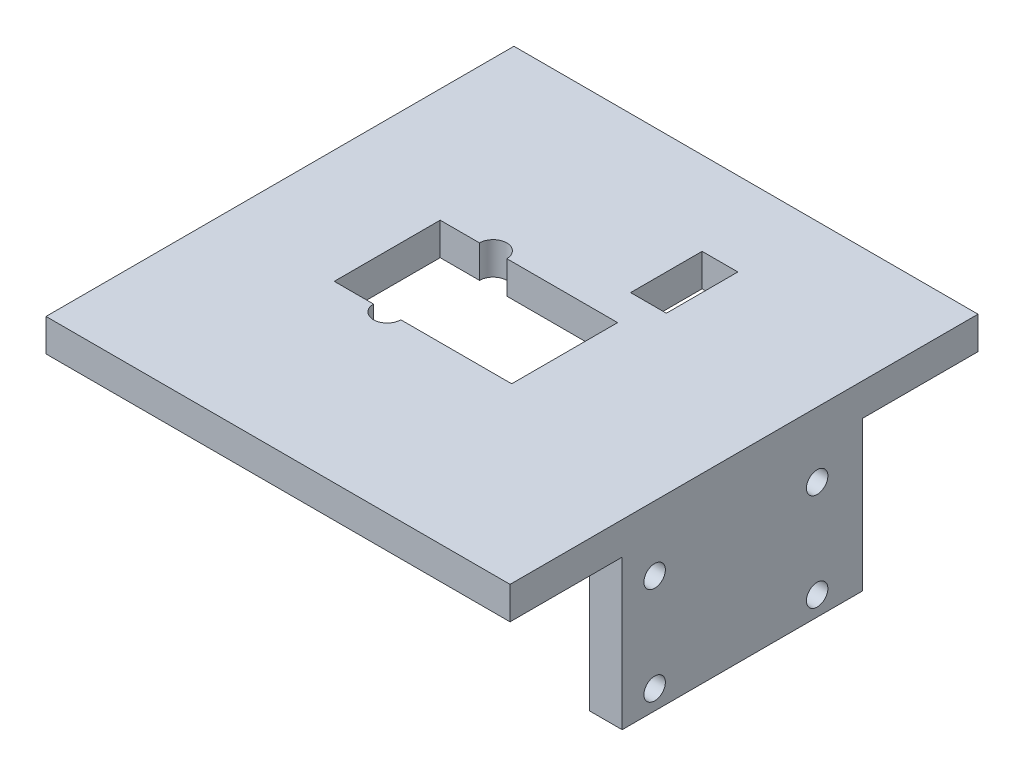
ISO-10303-21;
HEADER;
FILE_DESCRIPTION(('STEP AP214'),'2;1');
FILE_NAME('part.step','',(''),(''),'','','');
FILE_SCHEMA(('AUTOMOTIVE_DESIGN { 1 0 10303 214 1 1 1 1 }'));
ENDSEC;
DATA;
#1=APPLICATION_CONTEXT('core data for automotive mechanical design processes');
#2=APPLICATION_PROTOCOL_DEFINITION('international standard','automotive_design',2000,#1);
#3=PRODUCT_CONTEXT('',#1,'mechanical');
#4=PRODUCT('Part','Part','',(#3));
#5=PRODUCT_RELATED_PRODUCT_CATEGORY('part','',(#4));
#6=PRODUCT_DEFINITION_FORMATION('','',#4);
#7=PRODUCT_DEFINITION_CONTEXT('part definition',#1,'design');
#8=PRODUCT_DEFINITION('design','',#6,#7);
#9=PRODUCT_DEFINITION_SHAPE('','',#8);
#10=(LENGTH_UNIT() NAMED_UNIT(*) SI_UNIT(.MILLI.,.METRE.));
#11=(NAMED_UNIT(*) PLANE_ANGLE_UNIT() SI_UNIT($,.RADIAN.));
#12=(NAMED_UNIT(*) SI_UNIT($,.STERADIAN.) SOLID_ANGLE_UNIT());
#13=UNCERTAINTY_MEASURE_WITH_UNIT(LENGTH_MEASURE(1.E-05),#10,'distance_accuracy_value','');
#14=(GEOMETRIC_REPRESENTATION_CONTEXT(3) GLOBAL_UNCERTAINTY_ASSIGNED_CONTEXT((#13)) GLOBAL_UNIT_ASSIGNED_CONTEXT((#10,
#11,#12)) REPRESENTATION_CONTEXT('',''));
#15=CARTESIAN_POINT('',(0.,0.,0.));
#16=DIRECTION('',(0.,0.,1.));
#17=DIRECTION('',(1.,0.,0.));
#18=AXIS2_PLACEMENT_3D('',#15,#16,#17);
#19=CARTESIAN_POINT('',(55.,5.,0.));
#20=DIRECTION('',(-1.,0.,0.));
#21=DIRECTION('',(0.,0.,1.));
#22=AXIS2_PLACEMENT_3D('',#19,#20,#21);
#23=PLANE('',#22);
#24=CARTESIAN_POINT('',(55.,-20.,7.));
#25=DIRECTION('',(1.,0.,0.));
#26=DIRECTION('',(0.,0.,-1.));
#27=AXIS2_PLACEMENT_3D('',#24,#25,#26);
#28=CIRCLE('',#27,1.65);
#29=CARTESIAN_POINT('',(55.,-20.,5.35));
#30=VERTEX_POINT('',#29);
#31=EDGE_CURVE('E318',#30,#30,#28,.T.);
#32=ORIENTED_EDGE('',*,*,#31,.F.);
#33=EDGE_LOOP('',(#32));
#34=FACE_BOUND('',#33,.T.);
#35=CARTESIAN_POINT('',(55.,-20.,32.));
#36=DIRECTION('',(1.,0.,0.));
#37=DIRECTION('',(0.,0.,-1.));
#38=AXIS2_PLACEMENT_3D('',#35,#36,#37);
#39=CIRCLE('',#38,1.65);
#40=CARTESIAN_POINT('',(55.,-20.,30.35));
#41=VERTEX_POINT('',#40);
#42=EDGE_CURVE('E312',#41,#41,#39,.T.);
#43=ORIENTED_EDGE('',*,*,#42,.F.);
#44=EDGE_LOOP('',(#43));
#45=FACE_BOUND('',#44,.T.);
#46=CARTESIAN_POINT('',(55.,-5.,32.));
#47=DIRECTION('',(1.,0.,0.));
#48=DIRECTION('',(0.,0.,-1.));
#49=AXIS2_PLACEMENT_3D('',#46,#47,#48);
#50=CIRCLE('',#49,1.65);
#51=CARTESIAN_POINT('',(55.,-5.,30.35));
#52=VERTEX_POINT('',#51);
#53=EDGE_CURVE('E305',#52,#52,#50,.T.);
#54=ORIENTED_EDGE('',*,*,#53,.F.);
#55=EDGE_LOOP('',(#54));
#56=FACE_BOUND('',#55,.T.);
#57=CARTESIAN_POINT('',(55.,-5.,7.));
#58=DIRECTION('',(1.,0.,0.));
#59=DIRECTION('',(0.,0.,-1.));
#60=AXIS2_PLACEMENT_3D('',#57,#58,#59);
#61=CIRCLE('',#60,1.65);
#62=CARTESIAN_POINT('',(55.,-5.,5.35));
#63=VERTEX_POINT('',#62);
#64=EDGE_CURVE('E308',#63,#63,#61,.T.);
#65=ORIENTED_EDGE('',*,*,#64,.F.);
#66=EDGE_LOOP('',(#65));
#67=FACE_BOUND('',#66,.T.);
#68=DIRECTION('',(0.,0.,-1.));
#69=VECTOR('',#68,1.);
#70=CARTESIAN_POINT('',(55.,5.,0.));
#71=LINE('',#70,#69);
#72=CARTESIAN_POINT('',(55.,5.,54.25));
#73=VERTEX_POINT('',#72);
#74=CARTESIAN_POINT('',(55.,5.,-17.75));
#75=VERTEX_POINT('',#74);
#76=EDGE_CURVE('E347',#73,#75,#71,.T.);
#77=ORIENTED_EDGE('',*,*,#76,.F.);
#78=DIRECTION('',(0.,1.,0.));
#79=VECTOR('',#78,1.);
#80=CARTESIAN_POINT('',(55.,0.,54.25));
#81=LINE('',#80,#79);
#82=CARTESIAN_POINT('',(55.,0.,54.25));
#83=VERTEX_POINT('',#82);
#84=EDGE_CURVE('E189',#83,#73,#81,.T.);
#85=ORIENTED_EDGE('',*,*,#84,.F.);
#86=DIRECTION('',(0.,0.,-1.));
#87=VECTOR('',#86,1.);
#88=CARTESIAN_POINT('',(55.,0.,0.));
#89=LINE('',#88,#87);
#90=CARTESIAN_POINT('',(55.,0.,37.));
#91=VERTEX_POINT('',#90);
#92=EDGE_CURVE('E344',#83,#91,#89,.T.);
#93=ORIENTED_EDGE('',*,*,#92,.T.);
#94=DIRECTION('',(0.,-1.,0.));
#95=VECTOR('',#94,1.);
#96=CARTESIAN_POINT('',(55.,5.,37.));
#97=LINE('',#96,#95);
#98=CARTESIAN_POINT('',(55.,-23.,37.));
#99=VERTEX_POINT('',#98);
#100=EDGE_CURVE('E326',#91,#99,#97,.T.);
#101=ORIENTED_EDGE('',*,*,#100,.T.);
#102=DIRECTION('',(0.,0.,-1.));
#103=VECTOR('',#102,1.);
#104=CARTESIAN_POINT('',(55.,-23.,0.));
#105=LINE('',#104,#103);
#106=CARTESIAN_POINT('',(55.,-23.,0.));
#107=VERTEX_POINT('',#106);
#108=EDGE_CURVE('E333',#99,#107,#105,.T.);
#109=ORIENTED_EDGE('',*,*,#108,.T.);
#110=DIRECTION('',(0.,-1.,0.));
#111=VECTOR('',#110,1.);
#112=CARTESIAN_POINT('',(55.,5.,0.));
#113=LINE('',#112,#111);
#114=CARTESIAN_POINT('',(55.,0.,0.));
#115=VERTEX_POINT('',#114);
#116=EDGE_CURVE('E184',#115,#107,#113,.T.);
#117=ORIENTED_EDGE('',*,*,#116,.F.);
#118=DIRECTION('',(0.,0.,-1.));
#119=VECTOR('',#118,1.);
#120=CARTESIAN_POINT('',(55.,0.,0.));
#121=LINE('',#120,#119);
#122=CARTESIAN_POINT('',(55.,0.,-17.75));
#123=VERTEX_POINT('',#122);
#124=EDGE_CURVE('E178',#115,#123,#121,.T.);
#125=ORIENTED_EDGE('',*,*,#124,.T.);
#126=DIRECTION('',(0.,1.,0.));
#127=VECTOR('',#126,1.);
#128=CARTESIAN_POINT('',(55.,0.,-17.75));
#129=LINE('',#128,#127);
#130=EDGE_CURVE('E181',#123,#75,#129,.T.);
#131=ORIENTED_EDGE('',*,*,#130,.T.);
#132=EDGE_LOOP('',(#77,#85,#93,#101,#109,#117,#125,#131));
#133=FACE_BOUND('',#132,.T.);
#134=ADVANCED_FACE('F41',(#34,#45,#56,#67,#133),#23,.F.);
#135=CARTESIAN_POINT('',(0.,5.,0.));
#136=DIRECTION('',(0.,0.,1.));
#137=DIRECTION('',(1.,0.,0.));
#138=AXIS2_PLACEMENT_3D('',#135,#136,#137);
#139=PLANE('',#138);
#140=DIRECTION('',(0.,1.,0.));
#141=VECTOR('',#140,1.);
#142=CARTESIAN_POINT('',(50.,5.,0.));
#143=LINE('',#142,#141);
#144=CARTESIAN_POINT('',(50.,-23.,0.));
#145=VERTEX_POINT('',#144);
#146=CARTESIAN_POINT('',(50.,0.,0.));
#147=VERTEX_POINT('',#146);
#148=EDGE_CURVE('E329',#145,#147,#143,.T.);
#149=ORIENTED_EDGE('',*,*,#148,.T.);
#150=DIRECTION('',(1.,0.,0.));
#151=VECTOR('',#150,1.);
#152=CARTESIAN_POINT('',(0.,0.,0.));
#153=LINE('',#152,#151);
#154=EDGE_CURVE('E301',#147,#115,#153,.T.);
#155=ORIENTED_EDGE('',*,*,#154,.T.);
#156=ORIENTED_EDGE('',*,*,#116,.T.);
#157=DIRECTION('',(1.,0.,0.));
#158=VECTOR('',#157,1.);
#159=CARTESIAN_POINT('',(50.,-23.,0.));
#160=LINE('',#159,#158);
#161=EDGE_CURVE('E341',#145,#107,#160,.T.);
#162=ORIENTED_EDGE('',*,*,#161,.F.);
#163=EDGE_LOOP('',(#149,#155,#156,#162));
#164=FACE_BOUND('',#163,.T.);
#165=ADVANCED_FACE('F391',(#164),#139,.F.);
#166=CARTESIAN_POINT('',(0.,5.,0.));
#167=DIRECTION('',(0.,1.,0.));
#168=DIRECTION('',(0.,0.,1.));
#169=AXIS2_PLACEMENT_3D('',#166,#167,#168);
#170=PLANE('',#169);
#171=DIRECTION('',(0.,0.,1.));
#172=VECTOR('',#171,1.);
#173=CARTESIAN_POINT('',(25.4,5.,-4.9));
#174=LINE('',#173,#172);
#175=CARTESIAN_POINT('',(25.4,5.,-4.9));
#176=VERTEX_POINT('',#175);
#177=CARTESIAN_POINT('',(25.4,5.,6.1));
#178=VERTEX_POINT('',#177);
#179=EDGE_CURVE('E55',#176,#178,#174,.T.);
#180=ORIENTED_EDGE('',*,*,#179,.F.);
#181=DIRECTION('',(-1.,0.,0.));
#182=VECTOR('',#181,1.);
#183=CARTESIAN_POINT('',(25.4,5.,-4.9));
#184=LINE('',#183,#182);
#185=CARTESIAN_POINT('',(30.9,5.,-4.9));
#186=VERTEX_POINT('',#185);
#187=EDGE_CURVE('E222',#186,#176,#184,.T.);
#188=ORIENTED_EDGE('',*,*,#187,.F.);
#189=DIRECTION('',(0.,0.,-1.));
#190=VECTOR('',#189,1.);
#191=CARTESIAN_POINT('',(30.9,5.,-4.9));
#192=LINE('',#191,#190);
#193=CARTESIAN_POINT('',(30.9,5.,6.1));
#194=VERTEX_POINT('',#193);
#195=EDGE_CURVE('E219',#194,#186,#192,.T.);
#196=ORIENTED_EDGE('',*,*,#195,.F.);
#197=DIRECTION('',(1.,0.,0.));
#198=VECTOR('',#197,1.);
#199=CARTESIAN_POINT('',(25.4,5.,6.1));
#200=LINE('',#199,#198);
#201=EDGE_CURVE('E217',#178,#194,#200,.T.);
#202=ORIENTED_EDGE('',*,*,#201,.F.);
#203=EDGE_LOOP('',(#180,#188,#196,#202));
#204=FACE_BOUND('',#203,.T.);
#205=DIRECTION('',(-1.,0.,0.));
#206=VECTOR('',#205,1.);
#207=CARTESIAN_POINT('',(17.4,5.,11.1));
#208=LINE('',#207,#206);
#209=CARTESIAN_POINT('',(28.4,5.,11.1));
#210=VERTEX_POINT('',#209);
#211=CARTESIAN_POINT('',(11.35,5.,11.1));
#212=VERTEX_POINT('',#211);
#213=EDGE_CURVE('E237',#210,#212,#208,.T.);
#214=ORIENTED_EDGE('',*,*,#213,.F.);
#215=DIRECTION('',(0.,0.,-1.));
#216=VECTOR('',#215,1.);
#217=CARTESIAN_POINT('',(28.4,5.,11.1));
#218=LINE('',#217,#216);
#219=CARTESIAN_POINT('',(28.4,5.,27.4));
#220=VERTEX_POINT('',#219);
#221=EDGE_CURVE('E276',#220,#210,#218,.T.);
#222=ORIENTED_EDGE('',*,*,#221,.F.);
#223=DIRECTION('',(1.,0.,0.));
#224=VECTOR('',#223,1.);
#225=CARTESIAN_POINT('',(28.4,5.,27.4));
#226=LINE('',#225,#224);
#227=CARTESIAN_POINT('',(11.35,5.,27.4));
#228=VERTEX_POINT('',#227);
#229=EDGE_CURVE('E273',#228,#220,#226,.T.);
#230=ORIENTED_EDGE('',*,*,#229,.F.);
#231=CARTESIAN_POINT('',(9.25,5.,27.4));
#232=DIRECTION('',(0.,1.,0.));
#233=DIRECTION('',(0.,0.,1.));
#234=AXIS2_PLACEMENT_3D('',#231,#232,#233);
#235=CIRCLE('',#234,2.09999999999999);
#236=CARTESIAN_POINT('',(7.15,5.,27.4));
#237=VERTEX_POINT('',#236);
#238=EDGE_CURVE('E270',#237,#228,#235,.T.);
#239=ORIENTED_EDGE('',*,*,#238,.F.);
#240=DIRECTION('',(1.,0.,0.));
#241=VECTOR('',#240,1.);
#242=CARTESIAN_POINT('',(1.1,5.,27.4));
#243=LINE('',#242,#241);
#244=CARTESIAN_POINT('',(1.1,5.,27.4));
#245=VERTEX_POINT('',#244);
#246=EDGE_CURVE('E267',#245,#237,#243,.T.);
#247=ORIENTED_EDGE('',*,*,#246,.F.);
#248=DIRECTION('',(0.,0.,1.));
#249=VECTOR('',#248,1.);
#250=CARTESIAN_POINT('',(1.1,5.,27.4));
#251=LINE('',#250,#249);
#252=CARTESIAN_POINT('',(1.1,5.,11.1));
#253=VERTEX_POINT('',#252);
#254=EDGE_CURVE('E264',#253,#245,#251,.T.);
#255=ORIENTED_EDGE('',*,*,#254,.F.);
#256=DIRECTION('',(-1.,0.,0.));
#257=VECTOR('',#256,1.);
#258=CARTESIAN_POINT('',(1.1,5.,11.1));
#259=LINE('',#258,#257);
#260=CARTESIAN_POINT('',(7.15,5.,11.1));
#261=VERTEX_POINT('',#260);
#262=EDGE_CURVE('E261',#261,#253,#259,.T.);
#263=ORIENTED_EDGE('',*,*,#262,.F.);
#264=CARTESIAN_POINT('',(9.25000000000001,5.,11.1));
#265=DIRECTION('',(0.,1.,0.));
#266=DIRECTION('',(0.,0.,-1.));
#267=AXIS2_PLACEMENT_3D('',#264,#265,#266);
#268=CIRCLE('',#267,2.1);
#269=EDGE_CURVE('E228',#212,#261,#268,.T.);
#270=ORIENTED_EDGE('',*,*,#269,.F.);
#271=EDGE_LOOP('',(#214,#222,#230,#239,#247,#255,#263,#270));
#272=FACE_BOUND('',#271,.T.);
#273=DIRECTION('',(-1.,0.,0.));
#274=VECTOR('',#273,1.);
#275=CARTESIAN_POINT('',(0.,5.,54.25));
#276=LINE('',#275,#274);
#277=CARTESIAN_POINT('',(-16.4,5.,54.25));
#278=VERTEX_POINT('',#277);
#279=EDGE_CURVE('E283',#73,#278,#276,.T.);
#280=ORIENTED_EDGE('',*,*,#279,.F.);
#281=ORIENTED_EDGE('',*,*,#76,.T.);
#282=DIRECTION('',(-1.,0.,0.));
#283=VECTOR('',#282,1.);
#284=CARTESIAN_POINT('',(-16.4,5.,-17.75));
#285=LINE('',#284,#283);
#286=CARTESIAN_POINT('',(-16.4,5.,-17.75));
#287=VERTEX_POINT('',#286);
#288=EDGE_CURVE('E197',#75,#287,#285,.T.);
#289=ORIENTED_EDGE('',*,*,#288,.T.);
#290=DIRECTION('',(0.,0.,1.));
#291=VECTOR('',#290,1.);
#292=CARTESIAN_POINT('',(-16.4,5.,-15.75));
#293=LINE('',#292,#291);
#294=EDGE_CURVE('E208',#287,#278,#293,.T.);
#295=ORIENTED_EDGE('',*,*,#294,.T.);
#296=EDGE_LOOP('',(#280,#281,#289,#295));
#297=FACE_BOUND('',#296,.T.);
#298=ADVANCED_FACE('F373',(#204,#272,#297),#170,.T.);
#299=CARTESIAN_POINT('',(0.,0.,0.));
#300=DIRECTION('',(0.,1.,0.));
#301=DIRECTION('',(0.,0.,1.));
#302=AXIS2_PLACEMENT_3D('',#299,#300,#301);
#303=PLANE('',#302);
#304=DIRECTION('',(-1.,0.,0.));
#305=VECTOR('',#304,1.);
#306=CARTESIAN_POINT('',(0.,0.,-4.90000000000001));
#307=LINE('',#306,#305);
#308=CARTESIAN_POINT('',(30.9,0.,-4.9));
#309=VERTEX_POINT('',#308);
#310=CARTESIAN_POINT('',(25.4,0.,-4.9));
#311=VERTEX_POINT('',#310);
#312=EDGE_CURVE('E48',#309,#311,#307,.T.);
#313=ORIENTED_EDGE('',*,*,#312,.T.);
#314=DIRECTION('',(0.,0.,1.));
#315=VECTOR('',#314,1.);
#316=CARTESIAN_POINT('',(25.4,0.,0.));
#317=LINE('',#316,#315);
#318=CARTESIAN_POINT('',(25.4,0.,6.1));
#319=VERTEX_POINT('',#318);
#320=EDGE_CURVE('E11',#311,#319,#317,.T.);
#321=ORIENTED_EDGE('',*,*,#320,.T.);
#322=DIRECTION('',(1.,0.,0.));
#323=VECTOR('',#322,1.);
#324=CARTESIAN_POINT('',(0.,0.,6.10000000000001));
#325=LINE('',#324,#323);
#326=CARTESIAN_POINT('',(30.9,0.,6.1));
#327=VERTEX_POINT('',#326);
#328=EDGE_CURVE('E302',#319,#327,#325,.T.);
#329=ORIENTED_EDGE('',*,*,#328,.T.);
#330=DIRECTION('',(0.,0.,-1.));
#331=VECTOR('',#330,1.);
#332=CARTESIAN_POINT('',(30.9,0.,0.));
#333=LINE('',#332,#331);
#334=EDGE_CURVE('E358',#327,#309,#333,.T.);
#335=ORIENTED_EDGE('',*,*,#334,.T.);
#336=EDGE_LOOP('',(#313,#321,#329,#335));
#337=FACE_BOUND('',#336,.T.);
#338=DIRECTION('',(0.,0.,-1.));
#339=VECTOR('',#338,1.);
#340=CARTESIAN_POINT('',(28.4,0.,11.1));
#341=LINE('',#340,#339);
#342=CARTESIAN_POINT('',(28.4,0.,27.4));
#343=VERTEX_POINT('',#342);
#344=CARTESIAN_POINT('',(28.4,0.,11.1));
#345=VERTEX_POINT('',#344);
#346=EDGE_CURVE('E255',#343,#345,#341,.T.);
#347=ORIENTED_EDGE('',*,*,#346,.T.);
#348=DIRECTION('',(-1.,0.,0.));
#349=VECTOR('',#348,1.);
#350=CARTESIAN_POINT('',(11.35,0.,11.1));
#351=LINE('',#350,#349);
#352=CARTESIAN_POINT('',(11.35,0.,11.1));
#353=VERTEX_POINT('',#352);
#354=EDGE_CURVE('E233',#345,#353,#351,.T.);
#355=ORIENTED_EDGE('',*,*,#354,.T.);
#356=CARTESIAN_POINT('',(9.25000000000001,0.,11.1));
#357=DIRECTION('',(0.,1.,0.));
#358=DIRECTION('',(0.,0.,-1.));
#359=AXIS2_PLACEMENT_3D('',#356,#357,#358);
#360=CIRCLE('',#359,2.1);
#361=CARTESIAN_POINT('',(7.15,0.,11.1));
#362=VERTEX_POINT('',#361);
#363=EDGE_CURVE('E236',#353,#362,#360,.T.);
#364=ORIENTED_EDGE('',*,*,#363,.T.);
#365=DIRECTION('',(-1.,0.,0.));
#366=VECTOR('',#365,1.);
#367=CARTESIAN_POINT('',(1.1,0.,11.1));
#368=LINE('',#367,#366);
#369=CARTESIAN_POINT('',(1.1,0.,11.1));
#370=VERTEX_POINT('',#369);
#371=EDGE_CURVE('E240',#362,#370,#368,.T.);
#372=ORIENTED_EDGE('',*,*,#371,.T.);
#373=DIRECTION('',(0.,0.,1.));
#374=VECTOR('',#373,1.);
#375=CARTESIAN_POINT('',(1.1,0.,27.4));
#376=LINE('',#375,#374);
#377=CARTESIAN_POINT('',(1.1,0.,27.4));
#378=VERTEX_POINT('',#377);
#379=EDGE_CURVE('E243',#370,#378,#376,.T.);
#380=ORIENTED_EDGE('',*,*,#379,.T.);
#381=DIRECTION('',(1.,0.,0.));
#382=VECTOR('',#381,1.);
#383=CARTESIAN_POINT('',(1.1,0.,27.4));
#384=LINE('',#383,#382);
#385=CARTESIAN_POINT('',(7.15,0.,27.4));
#386=VERTEX_POINT('',#385);
#387=EDGE_CURVE('E246',#378,#386,#384,.T.);
#388=ORIENTED_EDGE('',*,*,#387,.T.);
#389=CARTESIAN_POINT('',(9.25,0.,27.4));
#390=DIRECTION('',(0.,1.,0.));
#391=DIRECTION('',(0.,0.,1.));
#392=AXIS2_PLACEMENT_3D('',#389,#390,#391);
#393=CIRCLE('',#392,2.09999999999999);
#394=CARTESIAN_POINT('',(11.35,0.,27.4));
#395=VERTEX_POINT('',#394);
#396=EDGE_CURVE('E249',#386,#395,#393,.T.);
#397=ORIENTED_EDGE('',*,*,#396,.T.);
#398=DIRECTION('',(1.,0.,0.));
#399=VECTOR('',#398,1.);
#400=CARTESIAN_POINT('',(11.35,0.,27.4));
#401=LINE('',#400,#399);
#402=EDGE_CURVE('E252',#395,#343,#401,.T.);
#403=ORIENTED_EDGE('',*,*,#402,.T.);
#404=EDGE_LOOP('',(#347,#355,#364,#372,#380,#388,#397,#403));
#405=FACE_BOUND('',#404,.T.);
#406=ORIENTED_EDGE('',*,*,#92,.F.);
#407=DIRECTION('',(-1.,0.,0.));
#408=VECTOR('',#407,1.);
#409=CARTESIAN_POINT('',(0.,0.,54.25));
#410=LINE('',#409,#408);
#411=CARTESIAN_POINT('',(-16.4,0.,54.25));
#412=VERTEX_POINT('',#411);
#413=EDGE_CURVE('E297',#83,#412,#410,.T.);
#414=ORIENTED_EDGE('',*,*,#413,.T.);
#415=DIRECTION('',(0.,0.,1.));
#416=VECTOR('',#415,1.);
#417=CARTESIAN_POINT('',(-16.4,0.,-15.75));
#418=LINE('',#417,#416);
#419=CARTESIAN_POINT('',(-16.4,0.,-17.75));
#420=VERTEX_POINT('',#419);
#421=EDGE_CURVE('E203',#420,#412,#418,.T.);
#422=ORIENTED_EDGE('',*,*,#421,.F.);
#423=DIRECTION('',(-1.,0.,0.));
#424=VECTOR('',#423,1.);
#425=CARTESIAN_POINT('',(-16.4,0.,-17.75));
#426=LINE('',#425,#424);
#427=EDGE_CURVE('E195',#123,#420,#426,.T.);
#428=ORIENTED_EDGE('',*,*,#427,.F.);
#429=ORIENTED_EDGE('',*,*,#124,.F.);
#430=ORIENTED_EDGE('',*,*,#154,.F.);
#431=DIRECTION('',(0.,0.,1.));
#432=VECTOR('',#431,1.);
#433=CARTESIAN_POINT('',(50.,0.,0.));
#434=LINE('',#433,#432);
#435=CARTESIAN_POINT('',(50.,0.,37.));
#436=VERTEX_POINT('',#435);
#437=EDGE_CURVE('E351',#147,#436,#434,.T.);
#438=ORIENTED_EDGE('',*,*,#437,.T.);
#439=DIRECTION('',(1.,0.,0.));
#440=VECTOR('',#439,1.);
#441=CARTESIAN_POINT('',(0.,0.,37.));
#442=LINE('',#441,#440);
#443=EDGE_CURVE('E303',#436,#91,#442,.T.);
#444=ORIENTED_EDGE('',*,*,#443,.T.);
#445=EDGE_LOOP('',(#406,#414,#422,#428,#429,#430,#438,#444));
#446=FACE_BOUND('',#445,.T.);
#447=ADVANCED_FACE('F201',(#337,#405,#446),#303,.F.);
#448=CARTESIAN_POINT('',(50.,5.,37.));
#449=DIRECTION('',(0.,0.,1.));
#450=DIRECTION('',(1.,0.,0.));
#451=AXIS2_PLACEMENT_3D('',#448,#449,#450);
#452=PLANE('',#451);
#453=ORIENTED_EDGE('',*,*,#443,.F.);
#454=DIRECTION('',(0.,-1.,0.));
#455=VECTOR('',#454,1.);
#456=CARTESIAN_POINT('',(50.,5.,37.));
#457=LINE('',#456,#455);
#458=CARTESIAN_POINT('',(50.,-23.,37.));
#459=VERTEX_POINT('',#458);
#460=EDGE_CURVE('E332',#436,#459,#457,.T.);
#461=ORIENTED_EDGE('',*,*,#460,.T.);
#462=DIRECTION('',(1.,0.,0.));
#463=VECTOR('',#462,1.);
#464=CARTESIAN_POINT('',(50.,-23.,37.));
#465=LINE('',#464,#463);
#466=EDGE_CURVE('E338',#459,#99,#465,.T.);
#467=ORIENTED_EDGE('',*,*,#466,.T.);
#468=ORIENTED_EDGE('',*,*,#100,.F.);
#469=EDGE_LOOP('',(#453,#461,#467,#468));
#470=FACE_BOUND('',#469,.T.);
#471=ADVANCED_FACE('F429',(#470),#452,.T.);
#472=CARTESIAN_POINT('',(50.,0.,0.));
#473=DIRECTION('',(-1.,0.,0.));
#474=DIRECTION('',(0.,0.,1.));
#475=AXIS2_PLACEMENT_3D('',#472,#473,#474);
#476=PLANE('',#475);
#477=CARTESIAN_POINT('',(50.,-20.,7.));
#478=DIRECTION('',(1.,0.,0.));
#479=DIRECTION('',(0.,0.,-1.));
#480=AXIS2_PLACEMENT_3D('',#477,#478,#479);
#481=CIRCLE('',#480,1.65);
#482=CARTESIAN_POINT('',(50.,-20.,5.35));
#483=VERTEX_POINT('',#482);
#484=EDGE_CURVE('E188',#483,#483,#481,.T.);
#485=ORIENTED_EDGE('',*,*,#484,.T.);
#486=EDGE_LOOP('',(#485));
#487=FACE_BOUND('',#486,.T.);
#488=CARTESIAN_POINT('',(50.,-20.,32.));
#489=DIRECTION('',(1.,0.,0.));
#490=DIRECTION('',(0.,0.,-1.));
#491=AXIS2_PLACEMENT_3D('',#488,#489,#490);
#492=CIRCLE('',#491,1.65);
#493=CARTESIAN_POINT('',(50.,-20.,30.35));
#494=VERTEX_POINT('',#493);
#495=EDGE_CURVE('E315',#494,#494,#492,.T.);
#496=ORIENTED_EDGE('',*,*,#495,.T.);
#497=EDGE_LOOP('',(#496));
#498=FACE_BOUND('',#497,.T.);
#499=CARTESIAN_POINT('',(50.,-5.,32.));
#500=DIRECTION('',(1.,0.,0.));
#501=DIRECTION('',(0.,0.,-1.));
#502=AXIS2_PLACEMENT_3D('',#499,#500,#501);
#503=CIRCLE('',#502,1.65);
#504=CARTESIAN_POINT('',(50.,-5.,30.35));
#505=VERTEX_POINT('',#504);
#506=EDGE_CURVE('E309',#505,#505,#503,.T.);
#507=ORIENTED_EDGE('',*,*,#506,.T.);
#508=EDGE_LOOP('',(#507));
#509=FACE_BOUND('',#508,.T.);
#510=CARTESIAN_POINT('',(50.,-5.,7.));
#511=DIRECTION('',(1.,0.,0.));
#512=DIRECTION('',(0.,0.,-1.));
#513=AXIS2_PLACEMENT_3D('',#510,#511,#512);
#514=CIRCLE('',#513,1.65);
#515=CARTESIAN_POINT('',(50.,-5.,5.35));
#516=VERTEX_POINT('',#515);
#517=EDGE_CURVE('E323',#516,#516,#514,.T.);
#518=ORIENTED_EDGE('',*,*,#517,.T.);
#519=EDGE_LOOP('',(#518));
#520=FACE_BOUND('',#519,.T.);
#521=ORIENTED_EDGE('',*,*,#437,.F.);
#522=ORIENTED_EDGE('',*,*,#148,.F.);
#523=DIRECTION('',(0.,0.,-1.));
#524=VECTOR('',#523,1.);
#525=CARTESIAN_POINT('',(50.,-23.,0.));
#526=LINE('',#525,#524);
#527=EDGE_CURVE('E335',#459,#145,#526,.T.);
#528=ORIENTED_EDGE('',*,*,#527,.F.);
#529=ORIENTED_EDGE('',*,*,#460,.F.);
#530=EDGE_LOOP('',(#521,#522,#528,#529));
#531=FACE_BOUND('',#530,.T.);
#532=ADVANCED_FACE('F420',(#487,#498,#509,#520,#531),#476,.T.);
#533=CARTESIAN_POINT('',(50.,-23.,0.));
#534=DIRECTION('',(0.,-1.,0.));
#535=DIRECTION('',(0.,0.,-1.));
#536=AXIS2_PLACEMENT_3D('',#533,#534,#535);
#537=PLANE('',#536);
#538=ORIENTED_EDGE('',*,*,#108,.F.);
#539=ORIENTED_EDGE('',*,*,#466,.F.);
#540=ORIENTED_EDGE('',*,*,#527,.T.);
#541=ORIENTED_EDGE('',*,*,#161,.T.);
#542=EDGE_LOOP('',(#538,#539,#540,#541));
#543=FACE_BOUND('',#542,.T.);
#544=ADVANCED_FACE('F410',(#543),#537,.T.);
#545=CARTESIAN_POINT('',(50.,-5.,7.));
#546=DIRECTION('',(1.,0.,0.));
#547=DIRECTION('',(0.,0.,-1.));
#548=AXIS2_PLACEMENT_3D('',#545,#546,#547);
#549=CYLINDRICAL_SURFACE('',#548,1.65);
#550=ORIENTED_EDGE('',*,*,#517,.F.);
#551=EDGE_LOOP('',(#550));
#552=FACE_BOUND('',#551,.T.);
#553=ORIENTED_EDGE('',*,*,#64,.T.);
#554=EDGE_LOOP('',(#553));
#555=FACE_BOUND('',#554,.T.);
#556=ADVANCED_FACE('F407',(#552,#555),#549,.F.);
#557=CARTESIAN_POINT('',(50.,-5.,32.));
#558=DIRECTION('',(1.,0.,0.));
#559=DIRECTION('',(0.,0.,-1.));
#560=AXIS2_PLACEMENT_3D('',#557,#558,#559);
#561=CYLINDRICAL_SURFACE('',#560,1.65);
#562=ORIENTED_EDGE('',*,*,#506,.F.);
#563=EDGE_LOOP('',(#562));
#564=FACE_BOUND('',#563,.T.);
#565=ORIENTED_EDGE('',*,*,#53,.T.);
#566=EDGE_LOOP('',(#565));
#567=FACE_BOUND('',#566,.T.);
#568=ADVANCED_FACE('F409',(#564,#567),#561,.F.);
#569=CARTESIAN_POINT('',(50.,-20.,32.));
#570=DIRECTION('',(1.,0.,0.));
#571=DIRECTION('',(0.,0.,-1.));
#572=AXIS2_PLACEMENT_3D('',#569,#570,#571);
#573=CYLINDRICAL_SURFACE('',#572,1.65);
#574=ORIENTED_EDGE('',*,*,#495,.F.);
#575=EDGE_LOOP('',(#574));
#576=FACE_BOUND('',#575,.T.);
#577=ORIENTED_EDGE('',*,*,#42,.T.);
#578=EDGE_LOOP('',(#577));
#579=FACE_BOUND('',#578,.T.);
#580=ADVANCED_FACE('F417',(#576,#579),#573,.F.);
#581=CARTESIAN_POINT('',(50.,-20.,7.));
#582=DIRECTION('',(1.,0.,0.));
#583=DIRECTION('',(0.,0.,-1.));
#584=AXIS2_PLACEMENT_3D('',#581,#582,#583);
#585=CYLINDRICAL_SURFACE('',#584,1.65);
#586=ORIENTED_EDGE('',*,*,#484,.F.);
#587=EDGE_LOOP('',(#586));
#588=FACE_BOUND('',#587,.T.);
#589=ORIENTED_EDGE('',*,*,#31,.T.);
#590=EDGE_LOOP('',(#589));
#591=FACE_BOUND('',#590,.T.);
#592=ADVANCED_FACE('F426',(#588,#591),#585,.F.);
#593=CARTESIAN_POINT('',(0.,0.,54.25));
#594=DIRECTION('',(0.,0.,-1.));
#595=DIRECTION('',(-1.,0.,0.));
#596=AXIS2_PLACEMENT_3D('',#593,#594,#595);
#597=PLANE('',#596);
#598=ORIENTED_EDGE('',*,*,#279,.T.);
#599=DIRECTION('',(0.,1.,0.));
#600=VECTOR('',#599,1.);
#601=CARTESIAN_POINT('',(-16.4,0.,54.25));
#602=LINE('',#601,#600);
#603=EDGE_CURVE('E211',#412,#278,#602,.T.);
#604=ORIENTED_EDGE('',*,*,#603,.F.);
#605=ORIENTED_EDGE('',*,*,#413,.F.);
#606=ORIENTED_EDGE('',*,*,#84,.T.);
#607=EDGE_LOOP('',(#598,#604,#605,#606));
#608=FACE_BOUND('',#607,.T.);
#609=ADVANCED_FACE('F555',(#608),#597,.F.);
#610=CARTESIAN_POINT('',(17.4,0.,11.1));
#611=DIRECTION('',(0.,0.,-1.));
#612=DIRECTION('',(-1.,0.,0.));
#613=AXIS2_PLACEMENT_3D('',#610,#611,#612);
#614=PLANE('',#613);
#615=ORIENTED_EDGE('',*,*,#213,.T.);
#616=DIRECTION('',(0.,1.,0.));
#617=VECTOR('',#616,1.);
#618=CARTESIAN_POINT('',(11.35,0.,11.1));
#619=LINE('',#618,#617);
#620=EDGE_CURVE('E258',#353,#212,#619,.T.);
#621=ORIENTED_EDGE('',*,*,#620,.F.);
#622=ORIENTED_EDGE('',*,*,#354,.F.);
#623=DIRECTION('',(0.,1.,0.));
#624=VECTOR('',#623,1.);
#625=CARTESIAN_POINT('',(28.4,0.,11.1));
#626=LINE('',#625,#624);
#627=EDGE_CURVE('E281',#345,#210,#626,.T.);
#628=ORIENTED_EDGE('',*,*,#627,.T.);
#629=EDGE_LOOP('',(#615,#621,#622,#628));
#630=FACE_BOUND('',#629,.T.);
#631=ADVANCED_FACE('F545',(#630),#614,.F.);
#632=CARTESIAN_POINT('',(28.4,0.,11.1));
#633=DIRECTION('',(1.,0.,0.));
#634=DIRECTION('',(0.,0.,-1.));
#635=AXIS2_PLACEMENT_3D('',#632,#633,#634);
#636=PLANE('',#635);
#637=ORIENTED_EDGE('',*,*,#221,.T.);
#638=ORIENTED_EDGE('',*,*,#627,.F.);
#639=ORIENTED_EDGE('',*,*,#346,.F.);
#640=DIRECTION('',(0.,1.,0.));
#641=VECTOR('',#640,1.);
#642=CARTESIAN_POINT('',(28.4,0.,27.4));
#643=LINE('',#642,#641);
#644=EDGE_CURVE('E284',#343,#220,#643,.T.);
#645=ORIENTED_EDGE('',*,*,#644,.T.);
#646=EDGE_LOOP('',(#637,#638,#639,#645));
#647=FACE_BOUND('',#646,.T.);
#648=ADVANCED_FACE('F536',(#647),#636,.F.);
#649=CARTESIAN_POINT('',(28.4,0.,27.4));
#650=DIRECTION('',(0.,0.,1.));
#651=DIRECTION('',(1.,0.,0.));
#652=AXIS2_PLACEMENT_3D('',#649,#650,#651);
#653=PLANE('',#652);
#654=ORIENTED_EDGE('',*,*,#229,.T.);
#655=ORIENTED_EDGE('',*,*,#644,.F.);
#656=ORIENTED_EDGE('',*,*,#402,.F.);
#657=DIRECTION('',(0.,1.,0.));
#658=VECTOR('',#657,1.);
#659=CARTESIAN_POINT('',(11.35,0.,27.4));
#660=LINE('',#659,#658);
#661=EDGE_CURVE('E286',#395,#228,#660,.T.);
#662=ORIENTED_EDGE('',*,*,#661,.T.);
#663=EDGE_LOOP('',(#654,#655,#656,#662));
#664=FACE_BOUND('',#663,.T.);
#665=ADVANCED_FACE('F526',(#664),#653,.F.);
#666=CARTESIAN_POINT('',(9.25,0.,27.4));
#667=DIRECTION('',(0.,1.,0.));
#668=DIRECTION('',(0.,0.,1.));
#669=AXIS2_PLACEMENT_3D('',#666,#667,#668);
#670=CYLINDRICAL_SURFACE('',#669,2.09999999999999);
#671=ORIENTED_EDGE('',*,*,#238,.T.);
#672=ORIENTED_EDGE('',*,*,#661,.F.);
#673=ORIENTED_EDGE('',*,*,#396,.F.);
#674=DIRECTION('',(0.,1.,0.));
#675=VECTOR('',#674,1.);
#676=CARTESIAN_POINT('',(7.15,0.,27.4));
#677=LINE('',#676,#675);
#678=EDGE_CURVE('E288',#386,#237,#677,.T.);
#679=ORIENTED_EDGE('',*,*,#678,.T.);
#680=EDGE_LOOP('',(#671,#672,#673,#679));
#681=FACE_BOUND('',#680,.T.);
#682=ADVANCED_FACE('F517',(#681),#670,.F.);
#683=CARTESIAN_POINT('',(1.1,0.,27.4));
#684=DIRECTION('',(0.,0.,1.));
#685=DIRECTION('',(1.,0.,0.));
#686=AXIS2_PLACEMENT_3D('',#683,#684,#685);
#687=PLANE('',#686);
#688=ORIENTED_EDGE('',*,*,#246,.T.);
#689=ORIENTED_EDGE('',*,*,#678,.F.);
#690=ORIENTED_EDGE('',*,*,#387,.F.);
#691=DIRECTION('',(0.,1.,0.));
#692=VECTOR('',#691,1.);
#693=CARTESIAN_POINT('',(1.1,0.,27.4));
#694=LINE('',#693,#692);
#695=EDGE_CURVE('E290',#378,#245,#694,.T.);
#696=ORIENTED_EDGE('',*,*,#695,.T.);
#697=EDGE_LOOP('',(#688,#689,#690,#696));
#698=FACE_BOUND('',#697,.T.);
#699=ADVANCED_FACE('F508',(#698),#687,.F.);
#700=CARTESIAN_POINT('',(1.1,0.,27.4));
#701=DIRECTION('',(-1.,0.,0.));
#702=DIRECTION('',(0.,0.,1.));
#703=AXIS2_PLACEMENT_3D('',#700,#701,#702);
#704=PLANE('',#703);
#705=ORIENTED_EDGE('',*,*,#254,.T.);
#706=ORIENTED_EDGE('',*,*,#695,.F.);
#707=ORIENTED_EDGE('',*,*,#379,.F.);
#708=DIRECTION('',(0.,1.,0.));
#709=VECTOR('',#708,1.);
#710=CARTESIAN_POINT('',(1.1,0.,11.1));
#711=LINE('',#710,#709);
#712=EDGE_CURVE('E292',#370,#253,#711,.T.);
#713=ORIENTED_EDGE('',*,*,#712,.T.);
#714=EDGE_LOOP('',(#705,#706,#707,#713));
#715=FACE_BOUND('',#714,.T.);
#716=ADVANCED_FACE('F499',(#715),#704,.F.);
#717=CARTESIAN_POINT('',(1.1,0.,11.1));
#718=DIRECTION('',(0.,0.,-1.));
#719=DIRECTION('',(-1.,0.,0.));
#720=AXIS2_PLACEMENT_3D('',#717,#718,#719);
#721=PLANE('',#720);
#722=ORIENTED_EDGE('',*,*,#262,.T.);
#723=ORIENTED_EDGE('',*,*,#712,.F.);
#724=ORIENTED_EDGE('',*,*,#371,.F.);
#725=DIRECTION('',(0.,1.,0.));
#726=VECTOR('',#725,1.);
#727=CARTESIAN_POINT('',(7.15,0.,11.1));
#728=LINE('',#727,#726);
#729=EDGE_CURVE('E294',#362,#261,#728,.T.);
#730=ORIENTED_EDGE('',*,*,#729,.T.);
#731=EDGE_LOOP('',(#722,#723,#724,#730));
#732=FACE_BOUND('',#731,.T.);
#733=ADVANCED_FACE('F385',(#732),#721,.F.);
#734=CARTESIAN_POINT('',(9.25000000000001,0.,11.1));
#735=DIRECTION('',(0.,1.,0.));
#736=DIRECTION('',(0.,0.,1.));
#737=AXIS2_PLACEMENT_3D('',#734,#735,#736);
#738=CYLINDRICAL_SURFACE('',#737,2.1);
#739=ORIENTED_EDGE('',*,*,#269,.T.);
#740=ORIENTED_EDGE('',*,*,#729,.F.);
#741=ORIENTED_EDGE('',*,*,#363,.F.);
#742=ORIENTED_EDGE('',*,*,#620,.T.);
#743=EDGE_LOOP('',(#739,#740,#741,#742));
#744=FACE_BOUND('',#743,.T.);
#745=ADVANCED_FACE('F378',(#744),#738,.F.);
#746=CARTESIAN_POINT('',(25.4,-3.,-4.9));
#747=DIRECTION('',(-1.,0.,0.));
#748=DIRECTION('',(0.,0.,1.));
#749=AXIS2_PLACEMENT_3D('',#746,#747,#748);
#750=PLANE('',#749);
#751=DIRECTION('',(0.,1.,0.));
#752=VECTOR('',#751,1.);
#753=CARTESIAN_POINT('',(25.4,-3.,-4.9));
#754=LINE('',#753,#752);
#755=EDGE_CURVE('E226',#311,#176,#754,.T.);
#756=ORIENTED_EDGE('',*,*,#755,.T.);
#757=ORIENTED_EDGE('',*,*,#179,.T.);
#758=DIRECTION('',(0.,1.,0.));
#759=VECTOR('',#758,1.);
#760=CARTESIAN_POINT('',(25.4,-3.,6.1));
#761=LINE('',#760,#759);
#762=EDGE_CURVE('E225',#319,#178,#761,.T.);
#763=ORIENTED_EDGE('',*,*,#762,.F.);
#764=ORIENTED_EDGE('',*,*,#320,.F.);
#765=EDGE_LOOP('',(#756,#757,#763,#764));
#766=FACE_BOUND('',#765,.T.);
#767=ADVANCED_FACE('F376',(#766),#750,.F.);
#768=CARTESIAN_POINT('',(25.4,-3.,-4.9));
#769=DIRECTION('',(0.,0.,-1.));
#770=DIRECTION('',(-1.,0.,0.));
#771=AXIS2_PLACEMENT_3D('',#768,#769,#770);
#772=PLANE('',#771);
#773=DIRECTION('',(0.,1.,0.));
#774=VECTOR('',#773,1.);
#775=CARTESIAN_POINT('',(30.9,-3.,-4.9));
#776=LINE('',#775,#774);
#777=EDGE_CURVE('E229',#309,#186,#776,.T.);
#778=ORIENTED_EDGE('',*,*,#777,.T.);
#779=ORIENTED_EDGE('',*,*,#187,.T.);
#780=ORIENTED_EDGE('',*,*,#755,.F.);
#781=ORIENTED_EDGE('',*,*,#312,.F.);
#782=EDGE_LOOP('',(#778,#779,#780,#781));
#783=FACE_BOUND('',#782,.T.);
#784=ADVANCED_FACE('F366',(#783),#772,.F.);
#785=CARTESIAN_POINT('',(30.9,-3.,-4.9));
#786=DIRECTION('',(1.,0.,0.));
#787=DIRECTION('',(0.,0.,-1.));
#788=AXIS2_PLACEMENT_3D('',#785,#786,#787);
#789=PLANE('',#788);
#790=DIRECTION('',(0.,1.,0.));
#791=VECTOR('',#790,1.);
#792=CARTESIAN_POINT('',(30.9,-3.,6.1));
#793=LINE('',#792,#791);
#794=EDGE_CURVE('E63',#327,#194,#793,.T.);
#795=ORIENTED_EDGE('',*,*,#794,.T.);
#796=ORIENTED_EDGE('',*,*,#195,.T.);
#797=ORIENTED_EDGE('',*,*,#777,.F.);
#798=ORIENTED_EDGE('',*,*,#334,.F.);
#799=EDGE_LOOP('',(#795,#796,#797,#798));
#800=FACE_BOUND('',#799,.T.);
#801=ADVANCED_FACE('F368',(#800),#789,.F.);
#802=CARTESIAN_POINT('',(25.4,-3.,6.1));
#803=DIRECTION('',(0.,0.,1.));
#804=DIRECTION('',(1.,0.,0.));
#805=AXIS2_PLACEMENT_3D('',#802,#803,#804);
#806=PLANE('',#805);
#807=ORIENTED_EDGE('',*,*,#762,.T.);
#808=ORIENTED_EDGE('',*,*,#201,.T.);
#809=ORIENTED_EDGE('',*,*,#794,.F.);
#810=ORIENTED_EDGE('',*,*,#328,.F.);
#811=EDGE_LOOP('',(#807,#808,#809,#810));
#812=FACE_BOUND('',#811,.T.);
#813=ADVANCED_FACE('F375',(#812),#806,.F.);
#814=CARTESIAN_POINT('',(-16.4,0.,-15.75));
#815=DIRECTION('',(-1.,0.,0.));
#816=DIRECTION('',(0.,0.,1.));
#817=AXIS2_PLACEMENT_3D('',#814,#815,#816);
#818=PLANE('',#817);
#819=ORIENTED_EDGE('',*,*,#294,.F.);
#820=DIRECTION('',(0.,1.,0.));
#821=VECTOR('',#820,1.);
#822=CARTESIAN_POINT('',(-16.4,0.,-17.75));
#823=LINE('',#822,#821);
#824=EDGE_CURVE('E198',#420,#287,#823,.T.);
#825=ORIENTED_EDGE('',*,*,#824,.F.);
#826=ORIENTED_EDGE('',*,*,#421,.T.);
#827=ORIENTED_EDGE('',*,*,#603,.T.);
#828=EDGE_LOOP('',(#819,#825,#826,#827));
#829=FACE_BOUND('',#828,.T.);
#830=ADVANCED_FACE('F446',(#829),#818,.T.);
#831=CARTESIAN_POINT('',(-16.4,0.,-17.75));
#832=DIRECTION('',(0.,0.,-1.));
#833=DIRECTION('',(-1.,0.,0.));
#834=AXIS2_PLACEMENT_3D('',#831,#832,#833);
#835=PLANE('',#834);
#836=ORIENTED_EDGE('',*,*,#288,.F.);
#837=ORIENTED_EDGE('',*,*,#130,.F.);
#838=ORIENTED_EDGE('',*,*,#427,.T.);
#839=ORIENTED_EDGE('',*,*,#824,.T.);
#840=EDGE_LOOP('',(#836,#837,#838,#839));
#841=FACE_BOUND('',#840,.T.);
#842=ADVANCED_FACE('F193',(#841),#835,.T.);
#843=CLOSED_SHELL('',(#134,#165,#298,#447,#471,#532,#544,#556,#568,#580,#592,#609,#631,#648,
#665,#682,#699,#716,#733,#745,#767,#784,#801,#813,#830,#842));
#844=MANIFOLD_SOLID_BREP('B2',#843);
#845=ADVANCED_BREP_SHAPE_REPRESENTATION('',(#18,#844),#14);
#846=SHAPE_DEFINITION_REPRESENTATION(#9,#845);
ENDSEC;
END-ISO-10303-21;
